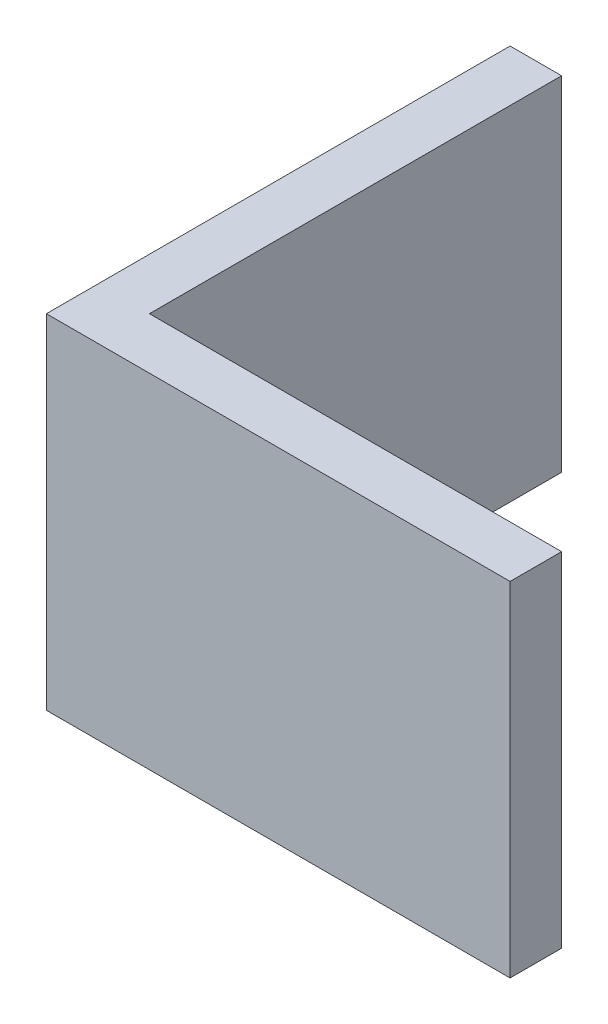
ISO-10303-21;
HEADER;
FILE_DESCRIPTION(('STEP AP214'),'2;1');
FILE_NAME('part.step','',(''),(''),'','','');
FILE_SCHEMA(('AUTOMOTIVE_DESIGN { 1 0 10303 214 1 1 1 1 }'));
ENDSEC;
DATA;
#1=APPLICATION_CONTEXT('core data for automotive mechanical design processes');
#2=APPLICATION_PROTOCOL_DEFINITION('international standard','automotive_design',2000,#1);
#3=PRODUCT_CONTEXT('',#1,'mechanical');
#4=PRODUCT('Part','Part','',(#3));
#5=PRODUCT_RELATED_PRODUCT_CATEGORY('part','',(#4));
#6=PRODUCT_DEFINITION_FORMATION('','',#4);
#7=PRODUCT_DEFINITION_CONTEXT('part definition',#1,'design');
#8=PRODUCT_DEFINITION('design','',#6,#7);
#9=PRODUCT_DEFINITION_SHAPE('','',#8);
#10=(LENGTH_UNIT() NAMED_UNIT(*) SI_UNIT(.MILLI.,.METRE.));
#11=(NAMED_UNIT(*) PLANE_ANGLE_UNIT() SI_UNIT($,.RADIAN.));
#12=(NAMED_UNIT(*) SI_UNIT($,.STERADIAN.) SOLID_ANGLE_UNIT());
#13=UNCERTAINTY_MEASURE_WITH_UNIT(LENGTH_MEASURE(1.E-05),#10,'distance_accuracy_value','');
#14=(GEOMETRIC_REPRESENTATION_CONTEXT(3) GLOBAL_UNCERTAINTY_ASSIGNED_CONTEXT((#13)) GLOBAL_UNIT_ASSIGNED_CONTEXT((#10,
#11,#12)) REPRESENTATION_CONTEXT('',''));
#15=CARTESIAN_POINT('',(0.,0.,0.));
#16=DIRECTION('',(0.,0.,1.));
#17=DIRECTION('',(1.,0.,0.));
#18=AXIS2_PLACEMENT_3D('',#15,#16,#17);
#19=CARTESIAN_POINT('',(0.,127.,0.));
#20=DIRECTION('',(0.,0.,-1.));
#21=DIRECTION('',(-1.,0.,0.));
#22=AXIS2_PLACEMENT_3D('',#19,#20,#21);
#23=PLANE('',#22);
#24=DIRECTION('',(1.,0.,0.));
#25=VECTOR('',#24,1.);
#26=CARTESIAN_POINT('',(0.,0.,0.));
#27=LINE('',#26,#25);
#28=CARTESIAN_POINT('',(0.,0.,0.));
#29=VERTEX_POINT('',#28);
#30=CARTESIAN_POINT('',(171.45,0.,0.));
#31=VERTEX_POINT('',#30);
#32=EDGE_CURVE('E139',#29,#31,#27,.T.);
#33=ORIENTED_EDGE('',*,*,#32,.T.);
#34=DIRECTION('',(0.,-1.,0.));
#35=VECTOR('',#34,1.);
#36=CARTESIAN_POINT('',(171.45,127.,0.));
#37=LINE('',#36,#35);
#38=CARTESIAN_POINT('',(171.45,127.,0.));
#39=VERTEX_POINT('',#38);
#40=EDGE_CURVE('E11',#39,#31,#37,.T.);
#41=ORIENTED_EDGE('',*,*,#40,.F.);
#42=DIRECTION('',(1.,0.,0.));
#43=VECTOR('',#42,1.);
#44=CARTESIAN_POINT('',(0.,127.,0.));
#45=LINE('',#44,#43);
#46=CARTESIAN_POINT('',(0.,127.,0.));
#47=VERTEX_POINT('',#46);
#48=EDGE_CURVE('E154',#47,#39,#45,.T.);
#49=ORIENTED_EDGE('',*,*,#48,.F.);
#50=DIRECTION('',(0.,-1.,0.));
#51=VECTOR('',#50,1.);
#52=CARTESIAN_POINT('',(0.,127.,0.));
#53=LINE('',#52,#51);
#54=EDGE_CURVE('E135',#47,#29,#53,.T.);
#55=ORIENTED_EDGE('',*,*,#54,.T.);
#56=EDGE_LOOP('',(#33,#41,#49,#55));
#57=FACE_BOUND('',#56,.T.);
#58=ADVANCED_FACE('F42',(#57),#23,.F.);
#59=CARTESIAN_POINT('',(171.45,127.,-19.05));
#60=DIRECTION('',(-1.,0.,0.));
#61=DIRECTION('',(0.,0.,1.));
#62=AXIS2_PLACEMENT_3D('',#59,#60,#61);
#63=PLANE('',#62);
#64=DIRECTION('',(0.,0.,-1.));
#65=VECTOR('',#64,1.);
#66=CARTESIAN_POINT('',(171.45,0.,-19.05));
#67=LINE('',#66,#65);
#68=CARTESIAN_POINT('',(171.45,0.,-19.05));
#69=VERTEX_POINT('',#68);
#70=EDGE_CURVE('E143',#31,#69,#67,.T.);
#71=ORIENTED_EDGE('',*,*,#70,.T.);
#72=DIRECTION('',(0.,-1.,0.));
#73=VECTOR('',#72,1.);
#74=CARTESIAN_POINT('',(171.45,127.,-19.05));
#75=LINE('',#74,#73);
#76=CARTESIAN_POINT('',(171.45,127.,-19.05));
#77=VERTEX_POINT('',#76);
#78=EDGE_CURVE('E51',#77,#69,#75,.T.);
#79=ORIENTED_EDGE('',*,*,#78,.F.);
#80=DIRECTION('',(0.,0.,-1.));
#81=VECTOR('',#80,1.);
#82=CARTESIAN_POINT('',(171.45,127.,-19.05));
#83=LINE('',#82,#81);
#84=EDGE_CURVE('E102',#39,#77,#83,.T.);
#85=ORIENTED_EDGE('',*,*,#84,.F.);
#86=ORIENTED_EDGE('',*,*,#40,.T.);
#87=EDGE_LOOP('',(#71,#79,#85,#86));
#88=FACE_BOUND('',#87,.T.);
#89=ADVANCED_FACE('F181',(#88),#63,.F.);
#90=CARTESIAN_POINT('',(19.05,127.,-19.05));
#91=DIRECTION('',(0.,0.,1.));
#92=DIRECTION('',(1.,0.,0.));
#93=AXIS2_PLACEMENT_3D('',#90,#91,#92);
#94=PLANE('',#93);
#95=DIRECTION('',(-1.,0.,0.));
#96=VECTOR('',#95,1.);
#97=CARTESIAN_POINT('',(19.05,0.,-19.05));
#98=LINE('',#97,#96);
#99=CARTESIAN_POINT('',(19.05,0.,-19.05));
#100=VERTEX_POINT('',#99);
#101=EDGE_CURVE('E146',#69,#100,#98,.T.);
#102=ORIENTED_EDGE('',*,*,#101,.T.);
#103=DIRECTION('',(0.,-1.,0.));
#104=VECTOR('',#103,1.);
#105=CARTESIAN_POINT('',(19.05,127.,-19.05));
#106=LINE('',#105,#104);
#107=CARTESIAN_POINT('',(19.05,127.,-19.05));
#108=VERTEX_POINT('',#107);
#109=EDGE_CURVE('E128',#108,#100,#106,.T.);
#110=ORIENTED_EDGE('',*,*,#109,.F.);
#111=DIRECTION('',(-1.,0.,0.));
#112=VECTOR('',#111,1.);
#113=CARTESIAN_POINT('',(19.05,127.,-19.05));
#114=LINE('',#113,#112);
#115=EDGE_CURVE('E117',#77,#108,#114,.T.);
#116=ORIENTED_EDGE('',*,*,#115,.F.);
#117=ORIENTED_EDGE('',*,*,#78,.T.);
#118=EDGE_LOOP('',(#102,#110,#116,#117));
#119=FACE_BOUND('',#118,.T.);
#120=ADVANCED_FACE('F163',(#119),#94,.F.);
#121=CARTESIAN_POINT('',(19.05,127.,-19.05));
#122=DIRECTION('',(-1.,0.,0.));
#123=DIRECTION('',(0.,0.,1.));
#124=AXIS2_PLACEMENT_3D('',#121,#122,#123);
#125=PLANE('',#124);
#126=DIRECTION('',(0.,0.,-1.));
#127=VECTOR('',#126,1.);
#128=CARTESIAN_POINT('',(19.05,0.,-19.05));
#129=LINE('',#128,#127);
#130=CARTESIAN_POINT('',(19.05,0.,-171.45));
#131=VERTEX_POINT('',#130);
#132=EDGE_CURVE('E126',#100,#131,#129,.T.);
#133=ORIENTED_EDGE('',*,*,#132,.T.);
#134=DIRECTION('',(0.,-1.,0.));
#135=VECTOR('',#134,1.);
#136=CARTESIAN_POINT('',(19.05,127.,-171.45));
#137=LINE('',#136,#135);
#138=CARTESIAN_POINT('',(19.05,127.,-171.45));
#139=VERTEX_POINT('',#138);
#140=EDGE_CURVE('E123',#139,#131,#137,.T.);
#141=ORIENTED_EDGE('',*,*,#140,.F.);
#142=DIRECTION('',(0.,0.,-1.));
#143=VECTOR('',#142,1.);
#144=CARTESIAN_POINT('',(19.05,127.,-19.05));
#145=LINE('',#144,#143);
#146=EDGE_CURVE('E111',#108,#139,#145,.T.);
#147=ORIENTED_EDGE('',*,*,#146,.F.);
#148=ORIENTED_EDGE('',*,*,#109,.T.);
#149=EDGE_LOOP('',(#133,#141,#147,#148));
#150=FACE_BOUND('',#149,.T.);
#151=ADVANCED_FACE('F124',(#150),#125,.F.);
#152=CARTESIAN_POINT('',(0.,127.,-171.45));
#153=DIRECTION('',(0.,0.,1.));
#154=DIRECTION('',(1.,0.,0.));
#155=AXIS2_PLACEMENT_3D('',#152,#153,#154);
#156=PLANE('',#155);
#157=DIRECTION('',(-1.,0.,0.));
#158=VECTOR('',#157,1.);
#159=CARTESIAN_POINT('',(0.,0.,-171.45));
#160=LINE('',#159,#158);
#161=CARTESIAN_POINT('',(0.,0.,-171.45));
#162=VERTEX_POINT('',#161);
#163=EDGE_CURVE('E87',#131,#162,#160,.T.);
#164=ORIENTED_EDGE('',*,*,#163,.T.);
#165=DIRECTION('',(0.,-1.,0.));
#166=VECTOR('',#165,1.);
#167=CARTESIAN_POINT('',(0.,127.,-171.45));
#168=LINE('',#167,#166);
#169=CARTESIAN_POINT('',(0.,127.,-171.45));
#170=VERTEX_POINT('',#169);
#171=EDGE_CURVE('E129',#170,#162,#168,.T.);
#172=ORIENTED_EDGE('',*,*,#171,.F.);
#173=DIRECTION('',(-1.,0.,0.));
#174=VECTOR('',#173,1.);
#175=CARTESIAN_POINT('',(0.,127.,-171.45));
#176=LINE('',#175,#174);
#177=EDGE_CURVE('E115',#139,#170,#176,.T.);
#178=ORIENTED_EDGE('',*,*,#177,.F.);
#179=ORIENTED_EDGE('',*,*,#140,.T.);
#180=EDGE_LOOP('',(#164,#172,#178,#179));
#181=FACE_BOUND('',#180,.T.);
#182=ADVANCED_FACE('F131',(#181),#156,.F.);
#183=CARTESIAN_POINT('',(0.,127.,0.));
#184=DIRECTION('',(1.,0.,0.));
#185=DIRECTION('',(0.,0.,-1.));
#186=AXIS2_PLACEMENT_3D('',#183,#184,#185);
#187=PLANE('',#186);
#188=DIRECTION('',(0.,0.,1.));
#189=VECTOR('',#188,1.);
#190=CARTESIAN_POINT('',(0.,0.,0.));
#191=LINE('',#190,#189);
#192=EDGE_CURVE('E93',#162,#29,#191,.T.);
#193=ORIENTED_EDGE('',*,*,#192,.T.);
#194=ORIENTED_EDGE('',*,*,#54,.F.);
#195=DIRECTION('',(0.,0.,1.));
#196=VECTOR('',#195,1.);
#197=CARTESIAN_POINT('',(0.,127.,0.));
#198=LINE('',#197,#196);
#199=EDGE_CURVE('E59',#170,#47,#198,.T.);
#200=ORIENTED_EDGE('',*,*,#199,.F.);
#201=ORIENTED_EDGE('',*,*,#171,.T.);
#202=EDGE_LOOP('',(#193,#194,#200,#201));
#203=FACE_BOUND('',#202,.T.);
#204=ADVANCED_FACE('F170',(#203),#187,.F.);
#205=CARTESIAN_POINT('',(0.,127.,0.));
#206=DIRECTION('',(0.,-1.,0.));
#207=DIRECTION('',(0.,0.,-1.));
#208=AXIS2_PLACEMENT_3D('',#205,#206,#207);
#209=PLANE('',#208);
#210=ORIENTED_EDGE('',*,*,#48,.T.);
#211=ORIENTED_EDGE('',*,*,#84,.T.);
#212=ORIENTED_EDGE('',*,*,#115,.T.);
#213=ORIENTED_EDGE('',*,*,#146,.T.);
#214=ORIENTED_EDGE('',*,*,#177,.T.);
#215=ORIENTED_EDGE('',*,*,#199,.T.);
#216=EDGE_LOOP('',(#210,#211,#212,#213,#214,#215));
#217=FACE_BOUND('',#216,.T.);
#218=ADVANCED_FACE('F113',(#217),#209,.F.);
#219=CARTESIAN_POINT('',(0.,0.,0.));
#220=DIRECTION('',(0.,-1.,0.));
#221=DIRECTION('',(0.,0.,-1.));
#222=AXIS2_PLACEMENT_3D('',#219,#220,#221);
#223=PLANE('',#222);
#224=ORIENTED_EDGE('',*,*,#32,.F.);
#225=ORIENTED_EDGE('',*,*,#192,.F.);
#226=ORIENTED_EDGE('',*,*,#163,.F.);
#227=ORIENTED_EDGE('',*,*,#132,.F.);
#228=ORIENTED_EDGE('',*,*,#101,.F.);
#229=ORIENTED_EDGE('',*,*,#70,.F.);
#230=EDGE_LOOP('',(#224,#225,#226,#227,#228,#229));
#231=FACE_BOUND('',#230,.T.);
#232=ADVANCED_FACE('F166',(#231),#223,.T.);
#233=CLOSED_SHELL('',(#58,#89,#120,#151,#182,#204,#218,#232));
#234=MANIFOLD_SOLID_BREP('B2',#233);
#235=ADVANCED_BREP_SHAPE_REPRESENTATION('',(#18,#234),#14);
#236=SHAPE_DEFINITION_REPRESENTATION(#9,#235);
ENDSEC;
END-ISO-10303-21;
